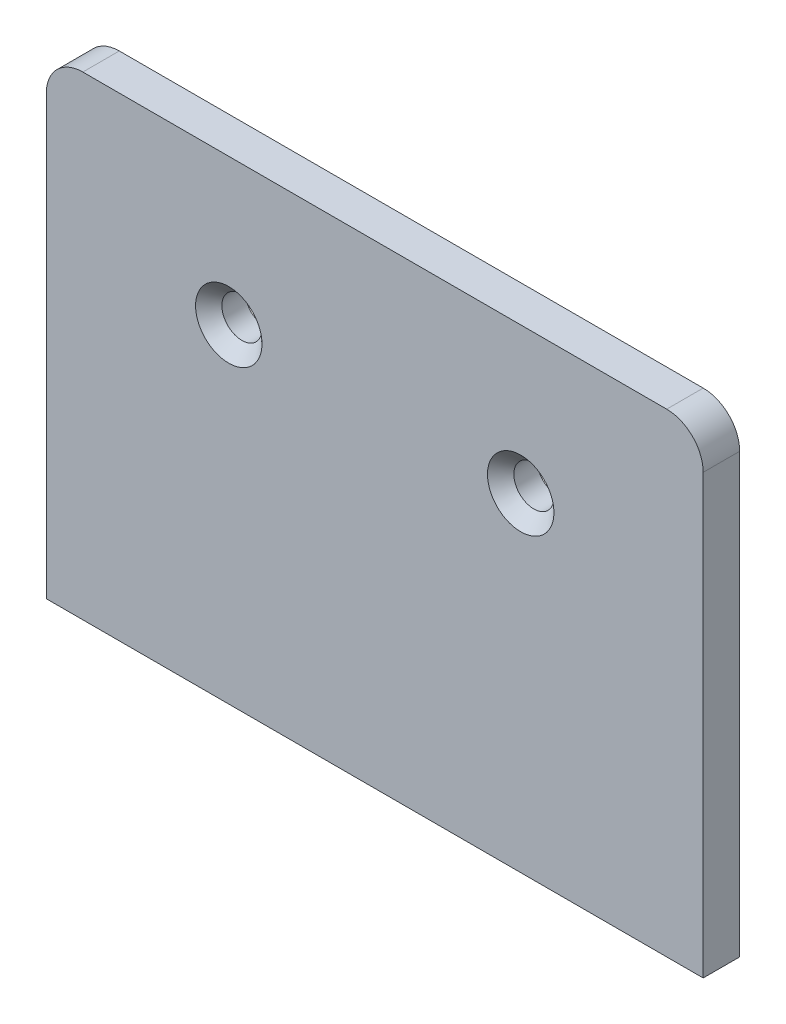
ISO-10303-21;
HEADER;
FILE_DESCRIPTION(('STEP AP214'),'2;1');
FILE_NAME('part.step','',(''),(''),'','','');
FILE_SCHEMA(('AUTOMOTIVE_DESIGN { 1 0 10303 214 1 1 1 1 }'));
ENDSEC;
DATA;
#1=APPLICATION_CONTEXT('core data for automotive mechanical design processes');
#2=APPLICATION_PROTOCOL_DEFINITION('international standard','automotive_design',2000,#1);
#3=PRODUCT_CONTEXT('',#1,'mechanical');
#4=PRODUCT('Part','Part','',(#3));
#5=PRODUCT_RELATED_PRODUCT_CATEGORY('part','',(#4));
#6=PRODUCT_DEFINITION_FORMATION('','',#4);
#7=PRODUCT_DEFINITION_CONTEXT('part definition',#1,'design');
#8=PRODUCT_DEFINITION('design','',#6,#7);
#9=PRODUCT_DEFINITION_SHAPE('','',#8);
#10=(LENGTH_UNIT() NAMED_UNIT(*) SI_UNIT(.MILLI.,.METRE.));
#11=(NAMED_UNIT(*) PLANE_ANGLE_UNIT() SI_UNIT($,.RADIAN.));
#12=(NAMED_UNIT(*) SI_UNIT($,.STERADIAN.) SOLID_ANGLE_UNIT());
#13=UNCERTAINTY_MEASURE_WITH_UNIT(LENGTH_MEASURE(1.E-05),#10,'distance_accuracy_value','');
#14=(GEOMETRIC_REPRESENTATION_CONTEXT(3) GLOBAL_UNCERTAINTY_ASSIGNED_CONTEXT((#13)) GLOBAL_UNIT_ASSIGNED_CONTEXT((#10,
#11,#12)) REPRESENTATION_CONTEXT('',''));
#15=CARTESIAN_POINT('',(0.,0.,0.));
#16=DIRECTION('',(0.,0.,1.));
#17=DIRECTION('',(1.,0.,0.));
#18=AXIS2_PLACEMENT_3D('',#15,#16,#17);
#19=CARTESIAN_POINT('',(45.,40.,5.));
#20=DIRECTION('',(0.,-1.,0.));
#21=DIRECTION('',(0.,0.,-1.));
#22=AXIS2_PLACEMENT_3D('',#19,#20,#21);
#23=PLANE('',#22);
#24=DIRECTION('',(-1.,0.,0.));
#25=VECTOR('',#24,1.);
#26=CARTESIAN_POINT('',(45.,40.,0.));
#27=LINE('',#26,#25);
#28=CARTESIAN_POINT('',(45.,40.,0.));
#29=VERTEX_POINT('',#28);
#30=CARTESIAN_POINT('',(-45.,40.,0.));
#31=VERTEX_POINT('',#30);
#32=EDGE_CURVE('E117',#29,#31,#27,.T.);
#33=ORIENTED_EDGE('',*,*,#32,.F.);
#34=DIRECTION('',(0.,0.,-1.));
#35=VECTOR('',#34,1.);
#36=CARTESIAN_POINT('',(45.,40.,5.));
#37=LINE('',#36,#35);
#38=CARTESIAN_POINT('',(45.,40.,5.));
#39=VERTEX_POINT('',#38);
#40=EDGE_CURVE('E94',#39,#29,#37,.T.);
#41=ORIENTED_EDGE('',*,*,#40,.F.);
#42=DIRECTION('',(-1.,0.,0.));
#43=VECTOR('',#42,1.);
#44=CARTESIAN_POINT('',(45.,40.,5.));
#45=LINE('',#44,#43);
#46=CARTESIAN_POINT('',(-45.,40.,5.));
#47=VERTEX_POINT('',#46);
#48=EDGE_CURVE('E101',#39,#47,#45,.T.);
#49=ORIENTED_EDGE('',*,*,#48,.T.);
#50=DIRECTION('',(0.,0.,-1.));
#51=VECTOR('',#50,1.);
#52=CARTESIAN_POINT('',(-45.,40.,5.));
#53=LINE('',#52,#51);
#54=EDGE_CURVE('E83',#47,#31,#53,.T.);
#55=ORIENTED_EDGE('',*,*,#54,.T.);
#56=EDGE_LOOP('',(#33,#41,#49,#55));
#57=FACE_BOUND('',#56,.T.);
#58=ADVANCED_FACE('F32',(#57),#23,.T.);
#59=CARTESIAN_POINT('',(45.,105.,5.));
#60=DIRECTION('',(1.,0.,0.));
#61=DIRECTION('',(0.,1.,0.));
#62=AXIS2_PLACEMENT_3D('',#59,#60,#61);
#63=PLANE('',#62);
#64=DIRECTION('',(0.,-1.,0.));
#65=VECTOR('',#64,1.);
#66=CARTESIAN_POINT('',(45.,105.,0.));
#67=LINE('',#66,#65);
#68=CARTESIAN_POINT('',(45.,100.,0.));
#69=VERTEX_POINT('',#68);
#70=EDGE_CURVE('E107',#69,#29,#67,.T.);
#71=ORIENTED_EDGE('',*,*,#70,.F.);
#72=DIRECTION('',(0.,0.,-1.));
#73=VECTOR('',#72,1.);
#74=CARTESIAN_POINT('',(45.,100.,5.));
#75=LINE('',#74,#73);
#76=CARTESIAN_POINT('',(45.,100.,5.));
#77=VERTEX_POINT('',#76);
#78=EDGE_CURVE('E139',#69,#77,#75,.F.);
#79=ORIENTED_EDGE('',*,*,#78,.T.);
#80=DIRECTION('',(0.,-1.,0.));
#81=VECTOR('',#80,1.);
#82=CARTESIAN_POINT('',(45.,105.,5.));
#83=LINE('',#82,#81);
#84=EDGE_CURVE('E95',#77,#39,#83,.T.);
#85=ORIENTED_EDGE('',*,*,#84,.T.);
#86=ORIENTED_EDGE('',*,*,#40,.T.);
#87=EDGE_LOOP('',(#71,#79,#85,#86));
#88=FACE_BOUND('',#87,.T.);
#89=ADVANCED_FACE('F152',(#88),#63,.T.);
#90=CARTESIAN_POINT('',(-45.,105.,5.));
#91=DIRECTION('',(0.,1.,0.));
#92=DIRECTION('',(0.,0.,1.));
#93=AXIS2_PLACEMENT_3D('',#90,#91,#92);
#94=PLANE('',#93);
#95=DIRECTION('',(1.,0.,0.));
#96=VECTOR('',#95,1.);
#97=CARTESIAN_POINT('',(-45.,105.,0.));
#98=LINE('',#97,#96);
#99=CARTESIAN_POINT('',(-40.,105.,0.));
#100=VERTEX_POINT('',#99);
#101=CARTESIAN_POINT('',(40.,105.,0.));
#102=VERTEX_POINT('',#101);
#103=EDGE_CURVE('E109',#100,#102,#98,.T.);
#104=ORIENTED_EDGE('',*,*,#103,.F.);
#105=DIRECTION('',(0.,0.,-1.));
#106=VECTOR('',#105,1.);
#107=CARTESIAN_POINT('',(-40.,105.,5.));
#108=LINE('',#107,#106);
#109=CARTESIAN_POINT('',(-40.,105.,5.));
#110=VERTEX_POINT('',#109);
#111=EDGE_CURVE('E40',#100,#110,#108,.F.);
#112=ORIENTED_EDGE('',*,*,#111,.T.);
#113=DIRECTION('',(1.,0.,0.));
#114=VECTOR('',#113,1.);
#115=CARTESIAN_POINT('',(-45.,105.,5.));
#116=LINE('',#115,#114);
#117=CARTESIAN_POINT('',(40.,105.,5.));
#118=VERTEX_POINT('',#117);
#119=EDGE_CURVE('E103',#110,#118,#116,.T.);
#120=ORIENTED_EDGE('',*,*,#119,.T.);
#121=DIRECTION('',(0.,0.,-1.));
#122=VECTOR('',#121,1.);
#123=CARTESIAN_POINT('',(40.,105.,5.));
#124=LINE('',#123,#122);
#125=EDGE_CURVE('E134',#118,#102,#124,.T.);
#126=ORIENTED_EDGE('',*,*,#125,.T.);
#127=EDGE_LOOP('',(#104,#112,#120,#126));
#128=FACE_BOUND('',#127,.T.);
#129=ADVANCED_FACE('F157',(#128),#94,.T.);
#130=CARTESIAN_POINT('',(-45.,40.,5.));
#131=DIRECTION('',(-1.,0.,0.));
#132=DIRECTION('',(0.,-1.,0.));
#133=AXIS2_PLACEMENT_3D('',#130,#131,#132);
#134=PLANE('',#133);
#135=DIRECTION('',(0.,1.,0.));
#136=VECTOR('',#135,1.);
#137=CARTESIAN_POINT('',(-45.,40.,5.));
#138=LINE('',#137,#136);
#139=CARTESIAN_POINT('',(-45.,100.,5.));
#140=VERTEX_POINT('',#139);
#141=EDGE_CURVE('E87',#47,#140,#138,.T.);
#142=ORIENTED_EDGE('',*,*,#141,.T.);
#143=DIRECTION('',(0.,0.,-1.));
#144=VECTOR('',#143,1.);
#145=CARTESIAN_POINT('',(-45.,100.,5.));
#146=LINE('',#145,#144);
#147=CARTESIAN_POINT('',(-45.,100.,0.));
#148=VERTEX_POINT('',#147);
#149=EDGE_CURVE('E144',#140,#148,#146,.T.);
#150=ORIENTED_EDGE('',*,*,#149,.T.);
#151=DIRECTION('',(0.,1.,0.));
#152=VECTOR('',#151,1.);
#153=CARTESIAN_POINT('',(-45.,40.,0.));
#154=LINE('',#153,#152);
#155=EDGE_CURVE('E89',#31,#148,#154,.T.);
#156=ORIENTED_EDGE('',*,*,#155,.F.);
#157=ORIENTED_EDGE('',*,*,#54,.F.);
#158=EDGE_LOOP('',(#142,#150,#156,#157));
#159=FACE_BOUND('',#158,.T.);
#160=ADVANCED_FACE('F85',(#159),#134,.T.);
#161=CARTESIAN_POINT('',(-45.,40.,5.));
#162=DIRECTION('',(0.,0.,-1.));
#163=DIRECTION('',(-1.,0.,0.));
#164=AXIS2_PLACEMENT_3D('',#161,#162,#163);
#165=PLANE('',#164);
#166=CARTESIAN_POINT('',(20.,85.,5.));
#167=DIRECTION('',(0.,0.,-1.));
#168=DIRECTION('',(-1.,0.,0.));
#169=AXIS2_PLACEMENT_3D('',#166,#167,#168);
#170=CIRCLE('',#169,4.55208992);
#171=CARTESIAN_POINT('',(15.44791008,85.,5.));
#172=VERTEX_POINT('',#171);
#173=EDGE_CURVE('E131',#172,#172,#170,.T.);
#174=ORIENTED_EDGE('',*,*,#173,.T.);
#175=EDGE_LOOP('',(#174));
#176=FACE_BOUND('',#175,.T.);
#177=CARTESIAN_POINT('',(-20.,85.,5.));
#178=DIRECTION('',(0.,0.,-1.));
#179=DIRECTION('',(-1.,0.,0.));
#180=AXIS2_PLACEMENT_3D('',#177,#178,#179);
#181=CIRCLE('',#180,4.55208991999999);
#182=CARTESIAN_POINT('',(-24.55208992,85.,5.));
#183=VERTEX_POINT('',#182);
#184=EDGE_CURVE('E125',#183,#183,#181,.T.);
#185=ORIENTED_EDGE('',*,*,#184,.T.);
#186=EDGE_LOOP('',(#185));
#187=FACE_BOUND('',#186,.T.);
#188=ORIENTED_EDGE('',*,*,#119,.F.);
#189=CARTESIAN_POINT('',(-40.,100.,5.));
#190=DIRECTION('',(0.,0.,-1.));
#191=DIRECTION('',(-1.,0.,0.));
#192=AXIS2_PLACEMENT_3D('',#189,#190,#191);
#193=CIRCLE('',#192,5.);
#194=EDGE_CURVE('E11',#110,#140,#193,.F.);
#195=ORIENTED_EDGE('',*,*,#194,.T.);
#196=ORIENTED_EDGE('',*,*,#141,.F.);
#197=ORIENTED_EDGE('',*,*,#48,.F.);
#198=ORIENTED_EDGE('',*,*,#84,.F.);
#199=CARTESIAN_POINT('',(40.,100.,5.));
#200=DIRECTION('',(0.,0.,-1.));
#201=DIRECTION('',(-1.,0.,0.));
#202=AXIS2_PLACEMENT_3D('',#199,#200,#201);
#203=CIRCLE('',#202,5.);
#204=EDGE_CURVE('E141',#77,#118,#203,.F.);
#205=ORIENTED_EDGE('',*,*,#204,.T.);
#206=EDGE_LOOP('',(#188,#195,#196,#197,#198,#205));
#207=FACE_BOUND('',#206,.T.);
#208=ADVANCED_FACE('F99',(#176,#187,#207),#165,.F.);
#209=CARTESIAN_POINT('',(-45.,40.,0.));
#210=DIRECTION('',(0.,0.,-1.));
#211=DIRECTION('',(-1.,0.,0.));
#212=AXIS2_PLACEMENT_3D('',#209,#210,#211);
#213=PLANE('',#212);
#214=CARTESIAN_POINT('',(20.,85.,0.));
#215=DIRECTION('',(0.,0.,1.));
#216=DIRECTION('',(1.,0.,0.));
#217=AXIS2_PLACEMENT_3D('',#214,#215,#216);
#218=CIRCLE('',#217,2.75000000000001);
#219=CARTESIAN_POINT('',(22.75,85.,0.));
#220=VERTEX_POINT('',#219);
#221=EDGE_CURVE('E191',#220,#220,#218,.T.);
#222=ORIENTED_EDGE('',*,*,#221,.T.);
#223=EDGE_LOOP('',(#222));
#224=FACE_BOUND('',#223,.T.);
#225=CARTESIAN_POINT('',(-20.,85.,0.));
#226=DIRECTION('',(0.,0.,1.));
#227=DIRECTION('',(1.,0.,0.));
#228=AXIS2_PLACEMENT_3D('',#225,#226,#227);
#229=CIRCLE('',#228,2.75000000000001);
#230=CARTESIAN_POINT('',(-17.25,85.,0.));
#231=VERTEX_POINT('',#230);
#232=EDGE_CURVE('E112',#231,#231,#229,.T.);
#233=ORIENTED_EDGE('',*,*,#232,.T.);
#234=EDGE_LOOP('',(#233));
#235=FACE_BOUND('',#234,.T.);
#236=ORIENTED_EDGE('',*,*,#155,.T.);
#237=CARTESIAN_POINT('',(-40.,100.,0.));
#238=DIRECTION('',(0.,0.,-1.));
#239=DIRECTION('',(-1.,0.,0.));
#240=AXIS2_PLACEMENT_3D('',#237,#238,#239);
#241=CIRCLE('',#240,5.);
#242=EDGE_CURVE('E54',#148,#100,#241,.T.);
#243=ORIENTED_EDGE('',*,*,#242,.T.);
#244=ORIENTED_EDGE('',*,*,#103,.T.);
#245=CARTESIAN_POINT('',(40.,100.,0.));
#246=DIRECTION('',(0.,0.,-1.));
#247=DIRECTION('',(-1.,0.,0.));
#248=AXIS2_PLACEMENT_3D('',#245,#246,#247);
#249=CIRCLE('',#248,5.);
#250=EDGE_CURVE('E137',#102,#69,#249,.T.);
#251=ORIENTED_EDGE('',*,*,#250,.T.);
#252=ORIENTED_EDGE('',*,*,#70,.T.);
#253=ORIENTED_EDGE('',*,*,#32,.T.);
#254=EDGE_LOOP('',(#236,#243,#244,#251,#252,#253));
#255=FACE_BOUND('',#254,.T.);
#256=ADVANCED_FACE('F147',(#224,#235,#255),#213,.T.);
#257=CARTESIAN_POINT('',(-20.,85.,5.));
#258=DIRECTION('',(0.,0.,1.));
#259=DIRECTION('',(1.,0.,0.));
#260=AXIS2_PLACEMENT_3D('',#257,#258,#259);
#261=CYLINDRICAL_SURFACE('',#260,2.75000000000001);
#262=CARTESIAN_POINT('',(-20.,85.,3.19791008000004));
#263=DIRECTION('',(0.,0.,-1.));
#264=DIRECTION('',(-1.,0.,0.));
#265=AXIS2_PLACEMENT_3D('',#262,#263,#264);
#266=CIRCLE('',#265,2.75000000000001);
#267=CARTESIAN_POINT('',(-22.75,85.,3.19791008000004));
#268=VERTEX_POINT('',#267);
#269=EDGE_CURVE('E121',#268,#268,#266,.F.);
#270=ORIENTED_EDGE('',*,*,#269,.T.);
#271=EDGE_LOOP('',(#270));
#272=FACE_BOUND('',#271,.T.);
#273=ORIENTED_EDGE('',*,*,#232,.F.);
#274=EDGE_LOOP('',(#273));
#275=FACE_BOUND('',#274,.T.);
#276=ADVANCED_FACE('F187',(#272,#275),#261,.F.);
#277=CARTESIAN_POINT('',(20.,85.,5.));
#278=DIRECTION('',(0.,0.,1.));
#279=DIRECTION('',(1.,0.,0.));
#280=AXIS2_PLACEMENT_3D('',#277,#278,#279);
#281=CYLINDRICAL_SURFACE('',#280,2.75000000000001);
#282=CARTESIAN_POINT('',(20.,85.,3.19791008000002));
#283=DIRECTION('',(0.,0.,-1.));
#284=DIRECTION('',(-1.,0.,0.));
#285=AXIS2_PLACEMENT_3D('',#282,#283,#284);
#286=CIRCLE('',#285,2.75000000000001);
#287=CARTESIAN_POINT('',(17.25,85.,3.19791008000002));
#288=VERTEX_POINT('',#287);
#289=EDGE_CURVE('E128',#288,#288,#286,.F.);
#290=ORIENTED_EDGE('',*,*,#289,.T.);
#291=EDGE_LOOP('',(#290));
#292=FACE_BOUND('',#291,.T.);
#293=ORIENTED_EDGE('',*,*,#221,.F.);
#294=EDGE_LOOP('',(#293));
#295=FACE_BOUND('',#294,.T.);
#296=ADVANCED_FACE('F175',(#292,#295),#281,.F.);
#297=CARTESIAN_POINT('',(-20.,85.,3.19791008000004));
#298=DIRECTION('',(0.,0.,1.));
#299=DIRECTION('',(1.,0.,0.));
#300=AXIS2_PLACEMENT_3D('',#297,#298,#299);
#301=CONICAL_SURFACE('',#300,2.75000000000001,0.785398163397453);
#302=ORIENTED_EDGE('',*,*,#184,.F.);
#303=EDGE_LOOP('',(#302));
#304=FACE_BOUND('',#303,.T.);
#305=ORIENTED_EDGE('',*,*,#269,.F.);
#306=EDGE_LOOP('',(#305));
#307=FACE_BOUND('',#306,.T.);
#308=ADVANCED_FACE('F172',(#304,#307),#301,.F.);
#309=CARTESIAN_POINT('',(20.,85.,3.19791008000002));
#310=DIRECTION('',(0.,0.,1.));
#311=DIRECTION('',(1.,0.,0.));
#312=AXIS2_PLACEMENT_3D('',#309,#310,#311);
#313=CONICAL_SURFACE('',#312,2.75000000000001,0.785398163397449);
#314=ORIENTED_EDGE('',*,*,#173,.F.);
#315=EDGE_LOOP('',(#314));
#316=FACE_BOUND('',#315,.T.);
#317=ORIENTED_EDGE('',*,*,#289,.F.);
#318=EDGE_LOOP('',(#317));
#319=FACE_BOUND('',#318,.T.);
#320=ADVANCED_FACE('F162',(#316,#319),#313,.F.);
#321=CARTESIAN_POINT('',(40.,100.,5.));
#322=DIRECTION('',(0.,0.,-1.));
#323=DIRECTION('',(-1.,0.,0.));
#324=AXIS2_PLACEMENT_3D('',#321,#322,#323);
#325=CYLINDRICAL_SURFACE('',#324,5.);
#326=ORIENTED_EDGE('',*,*,#204,.F.);
#327=ORIENTED_EDGE('',*,*,#78,.F.);
#328=ORIENTED_EDGE('',*,*,#250,.F.);
#329=ORIENTED_EDGE('',*,*,#125,.F.);
#330=EDGE_LOOP('',(#326,#327,#328,#329));
#331=FACE_BOUND('',#330,.T.);
#332=ADVANCED_FACE('F156',(#331),#325,.T.);
#333=CARTESIAN_POINT('',(-40.,100.,5.));
#334=DIRECTION('',(0.,0.,-1.));
#335=DIRECTION('',(-1.,0.,0.));
#336=AXIS2_PLACEMENT_3D('',#333,#334,#335);
#337=CYLINDRICAL_SURFACE('',#336,5.);
#338=ORIENTED_EDGE('',*,*,#194,.F.);
#339=ORIENTED_EDGE('',*,*,#111,.F.);
#340=ORIENTED_EDGE('',*,*,#242,.F.);
#341=ORIENTED_EDGE('',*,*,#149,.F.);
#342=EDGE_LOOP('',(#338,#339,#340,#341));
#343=FACE_BOUND('',#342,.T.);
#344=ADVANCED_FACE('F34',(#343),#337,.T.);
#345=CLOSED_SHELL('',(#58,#89,#129,#160,#208,#256,#276,#296,#308,#320,#332,#344));
#346=MANIFOLD_SOLID_BREP('B2',#345);
#347=ADVANCED_BREP_SHAPE_REPRESENTATION('',(#18,#346),#14);
#348=SHAPE_DEFINITION_REPRESENTATION(#9,#347);
ENDSEC;
END-ISO-10303-21;
